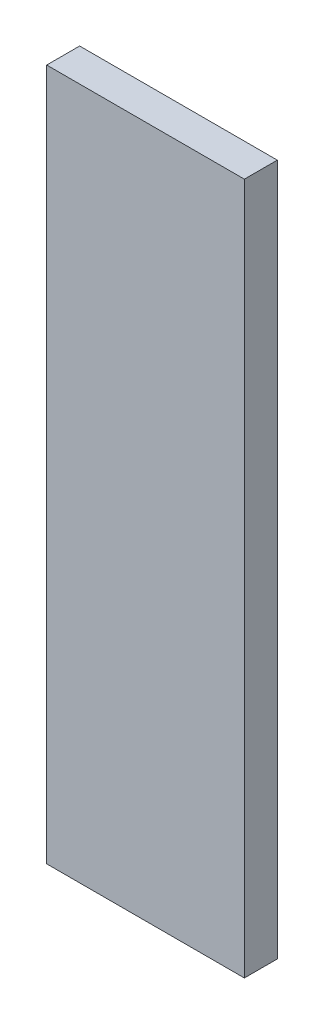
ISO-10303-21;
HEADER;
FILE_DESCRIPTION(('STEP AP214'),'2;1');
FILE_NAME('part.step','',(''),(''),'','','');
FILE_SCHEMA(('AUTOMOTIVE_DESIGN { 1 0 10303 214 1 1 1 1 }'));
ENDSEC;
DATA;
#1=APPLICATION_CONTEXT('core data for automotive mechanical design processes');
#2=APPLICATION_PROTOCOL_DEFINITION('international standard','automotive_design',2000,#1);
#3=PRODUCT_CONTEXT('',#1,'mechanical');
#4=PRODUCT('Part','Part','',(#3));
#5=PRODUCT_RELATED_PRODUCT_CATEGORY('part','',(#4));
#6=PRODUCT_DEFINITION_FORMATION('','',#4);
#7=PRODUCT_DEFINITION_CONTEXT('part definition',#1,'design');
#8=PRODUCT_DEFINITION('design','',#6,#7);
#9=PRODUCT_DEFINITION_SHAPE('','',#8);
#10=(LENGTH_UNIT() NAMED_UNIT(*) SI_UNIT(.MILLI.,.METRE.));
#11=(NAMED_UNIT(*) PLANE_ANGLE_UNIT() SI_UNIT($,.RADIAN.));
#12=(NAMED_UNIT(*) SI_UNIT($,.STERADIAN.) SOLID_ANGLE_UNIT());
#13=UNCERTAINTY_MEASURE_WITH_UNIT(LENGTH_MEASURE(1.E-05),#10,'distance_accuracy_value','');
#14=(GEOMETRIC_REPRESENTATION_CONTEXT(3) GLOBAL_UNCERTAINTY_ASSIGNED_CONTEXT((#13)) GLOBAL_UNIT_ASSIGNED_CONTEXT((#10,
#11,#12)) REPRESENTATION_CONTEXT('',''));
#15=CARTESIAN_POINT('',(0.,0.,0.));
#16=DIRECTION('',(0.,0.,1.));
#17=DIRECTION('',(1.,0.,0.));
#18=AXIS2_PLACEMENT_3D('',#15,#16,#17);
#19=CARTESIAN_POINT('',(0.,0.,-9.99999999999979));
#20=DIRECTION('',(-1.,0.,0.));
#21=DIRECTION('',(0.,-1.,0.));
#22=AXIS2_PLACEMENT_3D('',#19,#20,#21);
#23=PLANE('',#22);
#24=DIRECTION('',(0.,-1.,0.));
#25=VECTOR('',#24,1.);
#26=CARTESIAN_POINT('',(0.,0.,0.));
#27=LINE('',#26,#25);
#28=CARTESIAN_POINT('',(0.,0.,0.));
#29=VERTEX_POINT('',#28);
#30=CARTESIAN_POINT('',(0.,-210.,0.));
#31=VERTEX_POINT('',#30);
#32=EDGE_CURVE('E96',#29,#31,#27,.T.);
#33=ORIENTED_EDGE('',*,*,#32,.F.);
#34=DIRECTION('',(0.,0.,1.));
#35=VECTOR('',#34,1.);
#36=CARTESIAN_POINT('',(0.,0.,-9.99999999999979));
#37=LINE('',#36,#35);
#38=CARTESIAN_POINT('',(0.,0.,-9.99999999999979));
#39=VERTEX_POINT('',#38);
#40=EDGE_CURVE('E11',#39,#29,#37,.T.);
#41=ORIENTED_EDGE('',*,*,#40,.F.);
#42=DIRECTION('',(0.,-1.,0.));
#43=VECTOR('',#42,1.);
#44=CARTESIAN_POINT('',(0.,0.,-9.99999999999979));
#45=LINE('',#44,#43);
#46=CARTESIAN_POINT('',(0.,-210.,-9.99999999999979));
#47=VERTEX_POINT('',#46);
#48=EDGE_CURVE('E90',#39,#47,#45,.T.);
#49=ORIENTED_EDGE('',*,*,#48,.T.);
#50=DIRECTION('',(0.,0.,1.));
#51=VECTOR('',#50,1.);
#52=CARTESIAN_POINT('',(0.,-210.,-9.99999999999979));
#53=LINE('',#52,#51);
#54=EDGE_CURVE('E35',#47,#31,#53,.T.);
#55=ORIENTED_EDGE('',*,*,#54,.T.);
#56=EDGE_LOOP('',(#33,#41,#49,#55));
#57=FACE_BOUND('',#56,.T.);
#58=ADVANCED_FACE('F32',(#57),#23,.T.);
#59=CARTESIAN_POINT('',(0.,0.,-9.99999999999979));
#60=DIRECTION('',(0.,1.,0.));
#61=DIRECTION('',(0.,0.,1.));
#62=AXIS2_PLACEMENT_3D('',#59,#60,#61);
#63=PLANE('',#62);
#64=DIRECTION('',(-1.,0.,0.));
#65=VECTOR('',#64,1.);
#66=CARTESIAN_POINT('',(0.,0.,0.));
#67=LINE('',#66,#65);
#68=CARTESIAN_POINT('',(60.0000000000001,0.,0.));
#69=VERTEX_POINT('',#68);
#70=EDGE_CURVE('E92',#69,#29,#67,.T.);
#71=ORIENTED_EDGE('',*,*,#70,.F.);
#72=DIRECTION('',(0.,0.,1.));
#73=VECTOR('',#72,1.);
#74=CARTESIAN_POINT('',(60.0000000000001,0.,-9.99999999999979));
#75=LINE('',#74,#73);
#76=CARTESIAN_POINT('',(60.0000000000001,0.,-9.99999999999979));
#77=VERTEX_POINT('',#76);
#78=EDGE_CURVE('E41',#77,#69,#75,.T.);
#79=ORIENTED_EDGE('',*,*,#78,.F.);
#80=DIRECTION('',(-1.,0.,0.));
#81=VECTOR('',#80,1.);
#82=CARTESIAN_POINT('',(0.,0.,-9.99999999999979));
#83=LINE('',#82,#81);
#84=EDGE_CURVE('E87',#77,#39,#83,.T.);
#85=ORIENTED_EDGE('',*,*,#84,.T.);
#86=ORIENTED_EDGE('',*,*,#40,.T.);
#87=EDGE_LOOP('',(#71,#79,#85,#86));
#88=FACE_BOUND('',#87,.T.);
#89=ADVANCED_FACE('F106',(#88),#63,.T.);
#90=CARTESIAN_POINT('',(60.0000000000001,0.,-9.99999999999979));
#91=DIRECTION('',(1.,0.,0.));
#92=DIRECTION('',(0.,1.,0.));
#93=AXIS2_PLACEMENT_3D('',#90,#91,#92);
#94=PLANE('',#93);
#95=DIRECTION('',(0.,1.,0.));
#96=VECTOR('',#95,1.);
#97=CARTESIAN_POINT('',(60.0000000000001,0.,0.));
#98=LINE('',#97,#96);
#99=CARTESIAN_POINT('',(60.0000000000001,-210.,0.));
#100=VERTEX_POINT('',#99);
#101=EDGE_CURVE('E82',#100,#69,#98,.T.);
#102=ORIENTED_EDGE('',*,*,#101,.F.);
#103=DIRECTION('',(0.,0.,1.));
#104=VECTOR('',#103,1.);
#105=CARTESIAN_POINT('',(60.0000000000001,-210.,-9.99999999999979));
#106=LINE('',#105,#104);
#107=CARTESIAN_POINT('',(60.0000000000001,-210.,-9.99999999999979));
#108=VERTEX_POINT('',#107);
#109=EDGE_CURVE('E77',#108,#100,#106,.T.);
#110=ORIENTED_EDGE('',*,*,#109,.F.);
#111=DIRECTION('',(0.,1.,0.));
#112=VECTOR('',#111,1.);
#113=CARTESIAN_POINT('',(60.0000000000001,0.,-9.99999999999979));
#114=LINE('',#113,#112);
#115=EDGE_CURVE('E80',#108,#77,#114,.T.);
#116=ORIENTED_EDGE('',*,*,#115,.T.);
#117=ORIENTED_EDGE('',*,*,#78,.T.);
#118=EDGE_LOOP('',(#102,#110,#116,#117));
#119=FACE_BOUND('',#118,.T.);
#120=ADVANCED_FACE('F79',(#119),#94,.T.);
#121=CARTESIAN_POINT('',(0.,-210.,-9.99999999999979));
#122=DIRECTION('',(0.,-1.,0.));
#123=DIRECTION('',(0.,0.,-1.));
#124=AXIS2_PLACEMENT_3D('',#121,#122,#123);
#125=PLANE('',#124);
#126=DIRECTION('',(1.,0.,0.));
#127=VECTOR('',#126,1.);
#128=CARTESIAN_POINT('',(0.,-210.,0.));
#129=LINE('',#128,#127);
#130=EDGE_CURVE('E99',#31,#100,#129,.T.);
#131=ORIENTED_EDGE('',*,*,#130,.F.);
#132=ORIENTED_EDGE('',*,*,#54,.F.);
#133=DIRECTION('',(1.,0.,0.));
#134=VECTOR('',#133,1.);
#135=CARTESIAN_POINT('',(0.,-210.,-9.99999999999979));
#136=LINE('',#135,#134);
#137=EDGE_CURVE('E86',#47,#108,#136,.T.);
#138=ORIENTED_EDGE('',*,*,#137,.T.);
#139=ORIENTED_EDGE('',*,*,#109,.T.);
#140=EDGE_LOOP('',(#131,#132,#138,#139));
#141=FACE_BOUND('',#140,.T.);
#142=ADVANCED_FACE('F89',(#141),#125,.T.);
#143=CARTESIAN_POINT('',(0.,0.,-9.99999999999979));
#144=DIRECTION('',(0.,0.,1.));
#145=DIRECTION('',(1.,0.,0.));
#146=AXIS2_PLACEMENT_3D('',#143,#144,#145);
#147=PLANE('',#146);
#148=ORIENTED_EDGE('',*,*,#48,.F.);
#149=ORIENTED_EDGE('',*,*,#84,.F.);
#150=ORIENTED_EDGE('',*,*,#115,.F.);
#151=ORIENTED_EDGE('',*,*,#137,.F.);
#152=EDGE_LOOP('',(#148,#149,#150,#151));
#153=FACE_BOUND('',#152,.T.);
#154=ADVANCED_FACE('F85',(#153),#147,.F.);
#155=CARTESIAN_POINT('',(0.,0.,0.));
#156=DIRECTION('',(0.,0.,1.));
#157=DIRECTION('',(1.,0.,0.));
#158=AXIS2_PLACEMENT_3D('',#155,#156,#157);
#159=PLANE('',#158);
#160=ORIENTED_EDGE('',*,*,#32,.T.);
#161=ORIENTED_EDGE('',*,*,#130,.T.);
#162=ORIENTED_EDGE('',*,*,#101,.T.);
#163=ORIENTED_EDGE('',*,*,#70,.T.);
#164=EDGE_LOOP('',(#160,#161,#162,#163));
#165=FACE_BOUND('',#164,.T.);
#166=ADVANCED_FACE('F105',(#165),#159,.T.);
#167=CLOSED_SHELL('',(#58,#89,#120,#142,#154,#166));
#168=MANIFOLD_SOLID_BREP('B2',#167);
#169=ADVANCED_BREP_SHAPE_REPRESENTATION('',(#18,#168),#14);
#170=SHAPE_DEFINITION_REPRESENTATION(#9,#169);
ENDSEC;
END-ISO-10303-21;
